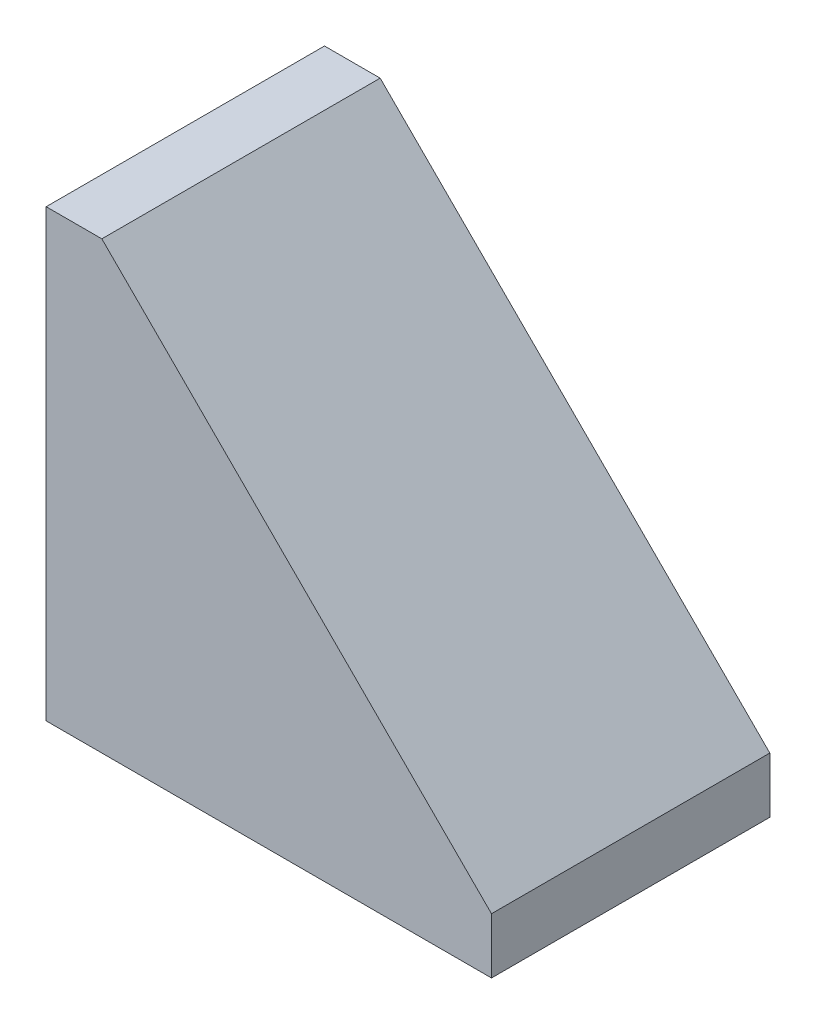
ISO-10303-21;
HEADER;
FILE_DESCRIPTION(('STEP AP214'),'2;1');
FILE_NAME('part.step','',(''),(''),'','','');
FILE_SCHEMA(('AUTOMOTIVE_DESIGN { 1 0 10303 214 1 1 1 1 }'));
ENDSEC;
DATA;
#1=APPLICATION_CONTEXT('core data for automotive mechanical design processes');
#2=APPLICATION_PROTOCOL_DEFINITION('international standard','automotive_design',2000,#1);
#3=PRODUCT_CONTEXT('',#1,'mechanical');
#4=PRODUCT('Part','Part','',(#3));
#5=PRODUCT_RELATED_PRODUCT_CATEGORY('part','',(#4));
#6=PRODUCT_DEFINITION_FORMATION('','',#4);
#7=PRODUCT_DEFINITION_CONTEXT('part definition',#1,'design');
#8=PRODUCT_DEFINITION('design','',#6,#7);
#9=PRODUCT_DEFINITION_SHAPE('','',#8);
#10=(LENGTH_UNIT() NAMED_UNIT(*) SI_UNIT(.MILLI.,.METRE.));
#11=(NAMED_UNIT(*) PLANE_ANGLE_UNIT() SI_UNIT($,.RADIAN.));
#12=(NAMED_UNIT(*) SI_UNIT($,.STERADIAN.) SOLID_ANGLE_UNIT());
#13=UNCERTAINTY_MEASURE_WITH_UNIT(LENGTH_MEASURE(1.E-05),#10,'distance_accuracy_value','');
#14=(GEOMETRIC_REPRESENTATION_CONTEXT(3) GLOBAL_UNCERTAINTY_ASSIGNED_CONTEXT((#13)) GLOBAL_UNIT_ASSIGNED_CONTEXT((#10,
#11,#12)) REPRESENTATION_CONTEXT('',''));
#15=CARTESIAN_POINT('',(0.,0.,0.));
#16=DIRECTION('',(0.,0.,1.));
#17=DIRECTION('',(1.,0.,0.));
#18=AXIS2_PLACEMENT_3D('',#15,#16,#17);
#19=CARTESIAN_POINT('',(25.4,0.,15.875));
#20=DIRECTION('',(0.,1.,0.));
#21=DIRECTION('',(0.,0.,1.));
#22=AXIS2_PLACEMENT_3D('',#19,#20,#21);
#23=PLANE('',#22);
#24=DIRECTION('',(1.,0.,0.));
#25=VECTOR('',#24,1.);
#26=CARTESIAN_POINT('',(25.4,0.,0.));
#27=LINE('',#26,#25);
#28=CARTESIAN_POINT('',(0.,0.,0.));
#29=VERTEX_POINT('',#28);
#30=CARTESIAN_POINT('',(25.4,0.,0.));
#31=VERTEX_POINT('',#30);
#32=EDGE_CURVE('E124',#29,#31,#27,.T.);
#33=ORIENTED_EDGE('',*,*,#32,.T.);
#34=DIRECTION('',(0.,0.,-1.));
#35=VECTOR('',#34,1.);
#36=CARTESIAN_POINT('',(25.4,0.,15.875));
#37=LINE('',#36,#35);
#38=CARTESIAN_POINT('',(25.4,0.,15.875));
#39=VERTEX_POINT('',#38);
#40=EDGE_CURVE('E11',#39,#31,#37,.T.);
#41=ORIENTED_EDGE('',*,*,#40,.F.);
#42=DIRECTION('',(1.,0.,0.));
#43=VECTOR('',#42,1.);
#44=CARTESIAN_POINT('',(25.4,0.,15.875));
#45=LINE('',#44,#43);
#46=CARTESIAN_POINT('',(0.,0.,15.875));
#47=VERTEX_POINT('',#46);
#48=EDGE_CURVE('E137',#47,#39,#45,.T.);
#49=ORIENTED_EDGE('',*,*,#48,.F.);
#50=DIRECTION('',(0.,0.,-1.));
#51=VECTOR('',#50,1.);
#52=CARTESIAN_POINT('',(0.,0.,15.875));
#53=LINE('',#52,#51);
#54=EDGE_CURVE('E120',#47,#29,#53,.T.);
#55=ORIENTED_EDGE('',*,*,#54,.T.);
#56=EDGE_LOOP('',(#33,#41,#49,#55));
#57=FACE_BOUND('',#56,.T.);
#58=ADVANCED_FACE('F45',(#57),#23,.F.);
#59=CARTESIAN_POINT('',(25.4,3.175,15.875));
#60=DIRECTION('',(-1.,0.,0.));
#61=DIRECTION('',(0.,0.,1.));
#62=AXIS2_PLACEMENT_3D('',#59,#60,#61);
#63=PLANE('',#62);
#64=DIRECTION('',(0.,1.,0.));
#65=VECTOR('',#64,1.);
#66=CARTESIAN_POINT('',(25.4,3.175,0.));
#67=LINE('',#66,#65);
#68=CARTESIAN_POINT('',(25.4,3.175,0.));
#69=VERTEX_POINT('',#68);
#70=EDGE_CURVE('E128',#31,#69,#67,.T.);
#71=ORIENTED_EDGE('',*,*,#70,.T.);
#72=DIRECTION('',(0.,0.,-1.));
#73=VECTOR('',#72,1.);
#74=CARTESIAN_POINT('',(25.4,3.175,15.875));
#75=LINE('',#74,#73);
#76=CARTESIAN_POINT('',(25.4,3.175,15.875));
#77=VERTEX_POINT('',#76);
#78=EDGE_CURVE('E54',#77,#69,#75,.T.);
#79=ORIENTED_EDGE('',*,*,#78,.F.);
#80=DIRECTION('',(0.,1.,0.));
#81=VECTOR('',#80,1.);
#82=CARTESIAN_POINT('',(25.4,3.175,15.875));
#83=LINE('',#82,#81);
#84=EDGE_CURVE('E96',#39,#77,#83,.T.);
#85=ORIENTED_EDGE('',*,*,#84,.F.);
#86=ORIENTED_EDGE('',*,*,#40,.T.);
#87=EDGE_LOOP('',(#71,#79,#85,#86));
#88=FACE_BOUND('',#87,.T.);
#89=ADVANCED_FACE('F159',(#88),#63,.F.);
#90=CARTESIAN_POINT('',(3.175,25.4,15.875));
#91=DIRECTION('',(-0.707106781186548,-0.707106781186548,0.));
#92=DIRECTION('',(0.707106781186548,-0.707106781186548,0.));
#93=AXIS2_PLACEMENT_3D('',#90,#91,#92);
#94=PLANE('',#93);
#95=DIRECTION('',(-0.707106781186547,0.707106781186547,0.));
#96=VECTOR('',#95,1.);
#97=CARTESIAN_POINT('',(3.175,25.4,0.));
#98=LINE('',#97,#96);
#99=CARTESIAN_POINT('',(3.175,25.4,0.));
#100=VERTEX_POINT('',#99);
#101=EDGE_CURVE('E112',#69,#100,#98,.T.);
#102=ORIENTED_EDGE('',*,*,#101,.T.);
#103=DIRECTION('',(0.,0.,-1.));
#104=VECTOR('',#103,1.);
#105=CARTESIAN_POINT('',(3.175,25.4,15.875));
#106=LINE('',#105,#104);
#107=CARTESIAN_POINT('',(3.175,25.4,15.875));
#108=VERTEX_POINT('',#107);
#109=EDGE_CURVE('E109',#108,#100,#106,.T.);
#110=ORIENTED_EDGE('',*,*,#109,.F.);
#111=DIRECTION('',(-0.707106781186547,0.707106781186547,0.));
#112=VECTOR('',#111,1.);
#113=CARTESIAN_POINT('',(3.175,25.4,15.875));
#114=LINE('',#113,#112);
#115=EDGE_CURVE('E100',#77,#108,#114,.T.);
#116=ORIENTED_EDGE('',*,*,#115,.F.);
#117=ORIENTED_EDGE('',*,*,#78,.T.);
#118=EDGE_LOOP('',(#102,#110,#116,#117));
#119=FACE_BOUND('',#118,.T.);
#120=ADVANCED_FACE('F110',(#119),#94,.F.);
#121=CARTESIAN_POINT('',(0.,25.4,15.875));
#122=DIRECTION('',(0.,-1.,0.));
#123=DIRECTION('',(0.,0.,-1.));
#124=AXIS2_PLACEMENT_3D('',#121,#122,#123);
#125=PLANE('',#124);
#126=DIRECTION('',(-1.,0.,0.));
#127=VECTOR('',#126,1.);
#128=CARTESIAN_POINT('',(0.,25.4,0.));
#129=LINE('',#128,#127);
#130=CARTESIAN_POINT('',(0.,25.4,0.));
#131=VERTEX_POINT('',#130);
#132=EDGE_CURVE('E82',#100,#131,#129,.T.);
#133=ORIENTED_EDGE('',*,*,#132,.T.);
#134=DIRECTION('',(0.,0.,-1.));
#135=VECTOR('',#134,1.);
#136=CARTESIAN_POINT('',(0.,25.4,15.875));
#137=LINE('',#136,#135);
#138=CARTESIAN_POINT('',(0.,25.4,15.875));
#139=VERTEX_POINT('',#138);
#140=EDGE_CURVE('E114',#139,#131,#137,.T.);
#141=ORIENTED_EDGE('',*,*,#140,.F.);
#142=DIRECTION('',(-1.,0.,0.));
#143=VECTOR('',#142,1.);
#144=CARTESIAN_POINT('',(0.,25.4,15.875));
#145=LINE('',#144,#143);
#146=EDGE_CURVE('E104',#108,#139,#145,.T.);
#147=ORIENTED_EDGE('',*,*,#146,.F.);
#148=ORIENTED_EDGE('',*,*,#109,.T.);
#149=EDGE_LOOP('',(#133,#141,#147,#148));
#150=FACE_BOUND('',#149,.T.);
#151=ADVANCED_FACE('F116',(#150),#125,.F.);
#152=CARTESIAN_POINT('',(0.,0.,15.875));
#153=DIRECTION('',(1.,0.,0.));
#154=DIRECTION('',(0.,0.,-1.));
#155=AXIS2_PLACEMENT_3D('',#152,#153,#154);
#156=PLANE('',#155);
#157=DIRECTION('',(0.,-1.,0.));
#158=VECTOR('',#157,1.);
#159=CARTESIAN_POINT('',(0.,0.,0.));
#160=LINE('',#159,#158);
#161=EDGE_CURVE('E88',#131,#29,#160,.T.);
#162=ORIENTED_EDGE('',*,*,#161,.T.);
#163=ORIENTED_EDGE('',*,*,#54,.F.);
#164=DIRECTION('',(0.,-1.,0.));
#165=VECTOR('',#164,1.);
#166=CARTESIAN_POINT('',(0.,0.,15.875));
#167=LINE('',#166,#165);
#168=EDGE_CURVE('E62',#139,#47,#167,.T.);
#169=ORIENTED_EDGE('',*,*,#168,.F.);
#170=ORIENTED_EDGE('',*,*,#140,.T.);
#171=EDGE_LOOP('',(#162,#163,#169,#170));
#172=FACE_BOUND('',#171,.T.);
#173=ADVANCED_FACE('F148',(#172),#156,.F.);
#174=CARTESIAN_POINT('',(0.,0.,15.875));
#175=DIRECTION('',(0.,0.,-1.));
#176=DIRECTION('',(-1.,0.,0.));
#177=AXIS2_PLACEMENT_3D('',#174,#175,#176);
#178=PLANE('',#177);
#179=ORIENTED_EDGE('',*,*,#48,.T.);
#180=ORIENTED_EDGE('',*,*,#84,.T.);
#181=ORIENTED_EDGE('',*,*,#115,.T.);
#182=ORIENTED_EDGE('',*,*,#146,.T.);
#183=ORIENTED_EDGE('',*,*,#168,.T.);
#184=EDGE_LOOP('',(#179,#180,#181,#182,#183));
#185=FACE_BOUND('',#184,.T.);
#186=ADVANCED_FACE('F102',(#185),#178,.F.);
#187=CARTESIAN_POINT('',(0.,0.,0.));
#188=DIRECTION('',(0.,0.,-1.));
#189=DIRECTION('',(-1.,0.,0.));
#190=AXIS2_PLACEMENT_3D('',#187,#188,#189);
#191=PLANE('',#190);
#192=ORIENTED_EDGE('',*,*,#32,.F.);
#193=ORIENTED_EDGE('',*,*,#161,.F.);
#194=ORIENTED_EDGE('',*,*,#132,.F.);
#195=ORIENTED_EDGE('',*,*,#101,.F.);
#196=ORIENTED_EDGE('',*,*,#70,.F.);
#197=EDGE_LOOP('',(#192,#193,#194,#195,#196));
#198=FACE_BOUND('',#197,.T.);
#199=ADVANCED_FACE('F144',(#198),#191,.T.);
#200=CLOSED_SHELL('',(#58,#89,#120,#151,#173,#186,#199));
#201=MANIFOLD_SOLID_BREP('B2',#200);
#202=ADVANCED_BREP_SHAPE_REPRESENTATION('',(#18,#201),#14);
#203=SHAPE_DEFINITION_REPRESENTATION(#9,#202);
ENDSEC;
END-ISO-10303-21;
